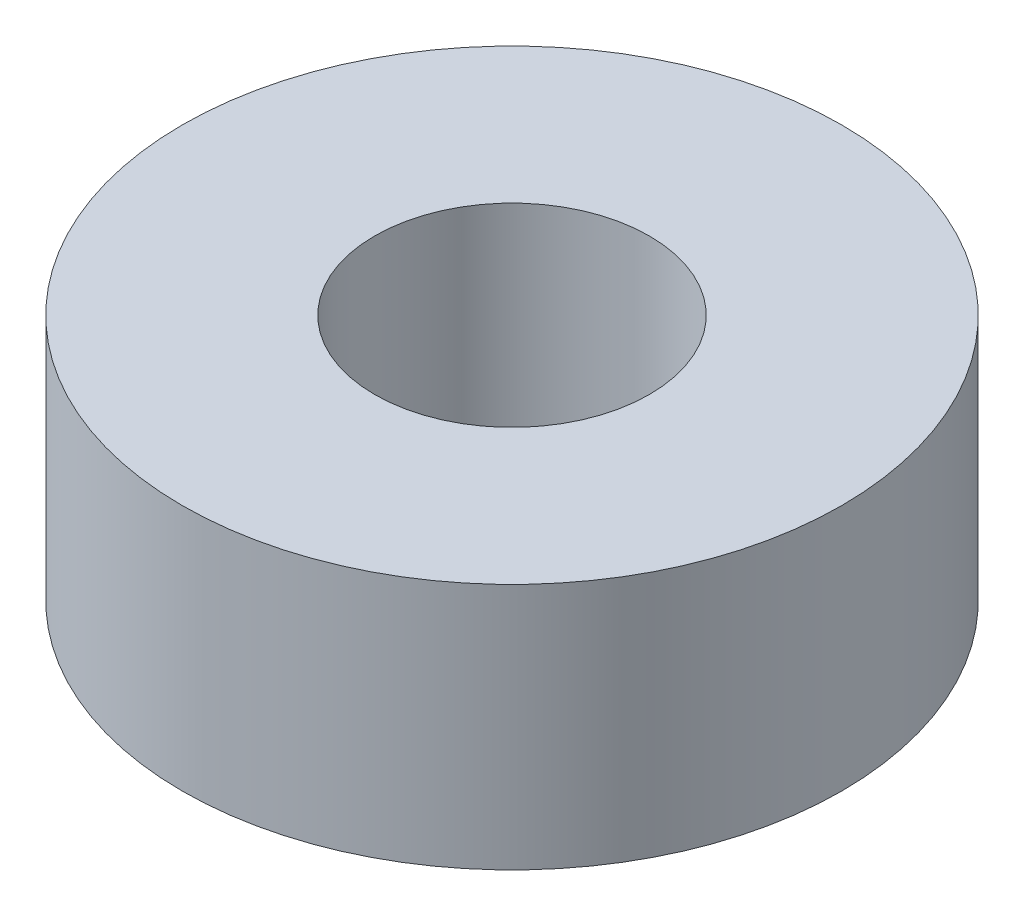
ISO-10303-21;
HEADER;
FILE_DESCRIPTION(('STEP AP214'),'2;1');
FILE_NAME('part.step','',(''),(''),'','','');
FILE_SCHEMA(('AUTOMOTIVE_DESIGN { 1 0 10303 214 1 1 1 1 }'));
ENDSEC;
DATA;
#1=APPLICATION_CONTEXT('core data for automotive mechanical design processes');
#2=APPLICATION_PROTOCOL_DEFINITION('international standard','automotive_design',2000,#1);
#3=PRODUCT_CONTEXT('',#1,'mechanical');
#4=PRODUCT('Part','Part','',(#3));
#5=PRODUCT_RELATED_PRODUCT_CATEGORY('part','',(#4));
#6=PRODUCT_DEFINITION_FORMATION('','',#4);
#7=PRODUCT_DEFINITION_CONTEXT('part definition',#1,'design');
#8=PRODUCT_DEFINITION('design','',#6,#7);
#9=PRODUCT_DEFINITION_SHAPE('','',#8);
#10=(LENGTH_UNIT() NAMED_UNIT(*) SI_UNIT(.MILLI.,.METRE.));
#11=(NAMED_UNIT(*) PLANE_ANGLE_UNIT() SI_UNIT($,.RADIAN.));
#12=(NAMED_UNIT(*) SI_UNIT($,.STERADIAN.) SOLID_ANGLE_UNIT());
#13=UNCERTAINTY_MEASURE_WITH_UNIT(LENGTH_MEASURE(1.E-05),#10,'distance_accuracy_value','');
#14=(GEOMETRIC_REPRESENTATION_CONTEXT(3) GLOBAL_UNCERTAINTY_ASSIGNED_CONTEXT((#13)) GLOBAL_UNIT_ASSIGNED_CONTEXT((#10,
#11,#12)) REPRESENTATION_CONTEXT('',''));
#15=CARTESIAN_POINT('',(0.,0.,0.));
#16=DIRECTION('',(0.,0.,1.));
#17=DIRECTION('',(1.,0.,0.));
#18=AXIS2_PLACEMENT_3D('',#15,#16,#17);
#19=CARTESIAN_POINT('',(0.,-4.5,0.));
#20=DIRECTION('',(0.,1.,0.));
#21=DIRECTION('',(0.,0.,1.));
#22=AXIS2_PLACEMENT_3D('',#19,#20,#21);
#23=CYLINDRICAL_SURFACE('',#22,12.);
#24=CARTESIAN_POINT('',(0.,-4.5,0.));
#25=DIRECTION('',(0.,1.,0.));
#26=DIRECTION('',(0.,0.,1.));
#27=AXIS2_PLACEMENT_3D('',#24,#25,#26);
#28=CIRCLE('',#27,12.);
#29=CARTESIAN_POINT('',(0.,-4.5,12.));
#30=VERTEX_POINT('',#29);
#31=EDGE_CURVE('E10',#30,#30,#28,.T.);
#32=ORIENTED_EDGE('',*,*,#31,.T.);
#33=EDGE_LOOP('',(#32));
#34=FACE_BOUND('',#33,.T.);
#35=CARTESIAN_POINT('',(0.,4.5,0.));
#36=DIRECTION('',(0.,1.,0.));
#37=DIRECTION('',(0.,0.,1.));
#38=AXIS2_PLACEMENT_3D('',#35,#36,#37);
#39=CIRCLE('',#38,12.);
#40=CARTESIAN_POINT('',(0.,4.5,12.));
#41=VERTEX_POINT('',#40);
#42=EDGE_CURVE('E45',#41,#41,#39,.T.);
#43=ORIENTED_EDGE('',*,*,#42,.F.);
#44=EDGE_LOOP('',(#43));
#45=FACE_BOUND('',#44,.T.);
#46=ADVANCED_FACE('F35',(#34,#45),#23,.T.);
#47=CARTESIAN_POINT('',(0.,-4.5,0.));
#48=DIRECTION('',(0.,1.,0.));
#49=DIRECTION('',(0.,0.,1.));
#50=AXIS2_PLACEMENT_3D('',#47,#48,#49);
#51=PLANE('',#50);
#52=CARTESIAN_POINT('',(0.,-4.5,0.));
#53=DIRECTION('',(0.,1.,0.));
#54=DIRECTION('',(0.,0.,1.));
#55=AXIS2_PLACEMENT_3D('',#52,#53,#54);
#56=CIRCLE('',#55,5.);
#57=CARTESIAN_POINT('',(0.,-4.5,5.));
#58=VERTEX_POINT('',#57);
#59=EDGE_CURVE('E41',#58,#58,#56,.T.);
#60=ORIENTED_EDGE('',*,*,#59,.T.);
#61=EDGE_LOOP('',(#60));
#62=FACE_BOUND('',#61,.T.);
#63=ORIENTED_EDGE('',*,*,#31,.F.);
#64=EDGE_LOOP('',(#63));
#65=FACE_BOUND('',#64,.T.);
#66=ADVANCED_FACE('F64',(#62,#65),#51,.F.);
#67=CARTESIAN_POINT('',(0.,-4.5,0.));
#68=DIRECTION('',(0.,1.,0.));
#69=DIRECTION('',(0.,0.,1.));
#70=AXIS2_PLACEMENT_3D('',#67,#68,#69);
#71=CYLINDRICAL_SURFACE('',#70,5.);
#72=ORIENTED_EDGE('',*,*,#59,.F.);
#73=EDGE_LOOP('',(#72));
#74=FACE_BOUND('',#73,.T.);
#75=CARTESIAN_POINT('',(0.,4.5,0.));
#76=DIRECTION('',(0.,1.,0.));
#77=DIRECTION('',(0.,0.,1.));
#78=AXIS2_PLACEMENT_3D('',#75,#76,#77);
#79=CIRCLE('',#78,5.);
#80=CARTESIAN_POINT('',(0.,4.5,5.));
#81=VERTEX_POINT('',#80);
#82=EDGE_CURVE('E49',#81,#81,#79,.T.);
#83=ORIENTED_EDGE('',*,*,#82,.T.);
#84=EDGE_LOOP('',(#83));
#85=FACE_BOUND('',#84,.T.);
#86=ADVANCED_FACE('F55',(#74,#85),#71,.F.);
#87=CARTESIAN_POINT('',(0.,4.5,0.));
#88=DIRECTION('',(0.,1.,0.));
#89=DIRECTION('',(0.,0.,1.));
#90=AXIS2_PLACEMENT_3D('',#87,#88,#89);
#91=PLANE('',#90);
#92=ORIENTED_EDGE('',*,*,#42,.T.);
#93=EDGE_LOOP('',(#92));
#94=FACE_BOUND('',#93,.T.);
#95=ORIENTED_EDGE('',*,*,#82,.F.);
#96=EDGE_LOOP('',(#95));
#97=FACE_BOUND('',#96,.T.);
#98=ADVANCED_FACE('F57',(#94,#97),#91,.T.);
#99=CLOSED_SHELL('',(#46,#66,#86,#98));
#100=MANIFOLD_SOLID_BREP('B2',#99);
#101=ADVANCED_BREP_SHAPE_REPRESENTATION('',(#18,#100),#14);
#102=SHAPE_DEFINITION_REPRESENTATION(#9,#101);
ENDSEC;
END-ISO-10303-21;
